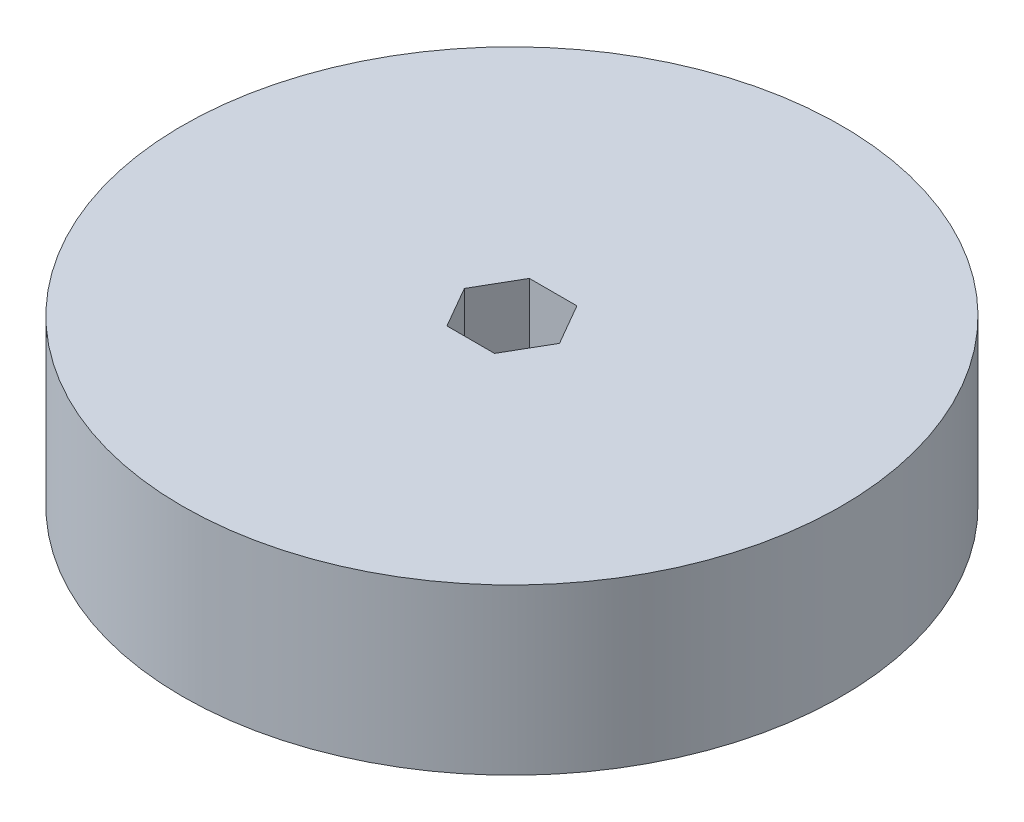
ISO-10303-21;
HEADER;
FILE_DESCRIPTION(('STEP AP214'),'2;1');
FILE_NAME('part.step','',(''),(''),'','','');
FILE_SCHEMA(('AUTOMOTIVE_DESIGN { 1 0 10303 214 1 1 1 1 }'));
ENDSEC;
DATA;
#1=APPLICATION_CONTEXT('core data for automotive mechanical design processes');
#2=APPLICATION_PROTOCOL_DEFINITION('international standard','automotive_design',2000,#1);
#3=PRODUCT_CONTEXT('',#1,'mechanical');
#4=PRODUCT('Part','Part','',(#3));
#5=PRODUCT_RELATED_PRODUCT_CATEGORY('part','',(#4));
#6=PRODUCT_DEFINITION_FORMATION('','',#4);
#7=PRODUCT_DEFINITION_CONTEXT('part definition',#1,'design');
#8=PRODUCT_DEFINITION('design','',#6,#7);
#9=PRODUCT_DEFINITION_SHAPE('','',#8);
#10=(LENGTH_UNIT() NAMED_UNIT(*) SI_UNIT(.MILLI.,.METRE.));
#11=(NAMED_UNIT(*) PLANE_ANGLE_UNIT() SI_UNIT($,.RADIAN.));
#12=(NAMED_UNIT(*) SI_UNIT($,.STERADIAN.) SOLID_ANGLE_UNIT());
#13=UNCERTAINTY_MEASURE_WITH_UNIT(LENGTH_MEASURE(1.E-05),#10,'distance_accuracy_value','');
#14=(GEOMETRIC_REPRESENTATION_CONTEXT(3) GLOBAL_UNCERTAINTY_ASSIGNED_CONTEXT((#13)) GLOBAL_UNIT_ASSIGNED_CONTEXT((#10,
#11,#12)) REPRESENTATION_CONTEXT('',''));
#15=CARTESIAN_POINT('',(0.,0.,0.));
#16=DIRECTION('',(0.,0.,1.));
#17=DIRECTION('',(1.,0.,0.));
#18=AXIS2_PLACEMENT_3D('',#15,#16,#17);
#19=CARTESIAN_POINT('',(0.,25.4,0.));
#20=DIRECTION('',(0.,-1.,0.));
#21=DIRECTION('',(0.,0.,-1.));
#22=AXIS2_PLACEMENT_3D('',#19,#20,#21);
#23=CYLINDRICAL_SURFACE('',#22,50.8);
#24=CARTESIAN_POINT('',(0.,25.4,0.));
#25=DIRECTION('',(0.,1.,0.));
#26=DIRECTION('',(0.,0.,1.));
#27=AXIS2_PLACEMENT_3D('',#24,#25,#26);
#28=CIRCLE('',#27,50.8);
#29=CARTESIAN_POINT('',(0.,25.4,50.8));
#30=VERTEX_POINT('',#29);
#31=EDGE_CURVE('E11',#30,#30,#28,.T.);
#32=ORIENTED_EDGE('',*,*,#31,.F.);
#33=EDGE_LOOP('',(#32));
#34=FACE_BOUND('',#33,.T.);
#35=CARTESIAN_POINT('',(0.,0.,0.));
#36=DIRECTION('',(0.,1.,0.));
#37=DIRECTION('',(0.,0.,1.));
#38=AXIS2_PLACEMENT_3D('',#35,#36,#37);
#39=CIRCLE('',#38,50.8);
#40=CARTESIAN_POINT('',(0.,0.,50.8));
#41=VERTEX_POINT('',#40);
#42=EDGE_CURVE('E46',#41,#41,#39,.T.);
#43=ORIENTED_EDGE('',*,*,#42,.T.);
#44=EDGE_LOOP('',(#43));
#45=FACE_BOUND('',#44,.T.);
#46=ADVANCED_FACE('F43',(#34,#45),#23,.T.);
#47=CARTESIAN_POINT('',(0.,25.4,0.));
#48=DIRECTION('',(0.,1.,0.));
#49=DIRECTION('',(0.,0.,1.));
#50=AXIS2_PLACEMENT_3D('',#47,#48,#49);
#51=PLANE('',#50);
#52=DIRECTION('',(-0.5,0.,-0.866025403784438));
#53=VECTOR('',#52,1.);
#54=CARTESIAN_POINT('',(7.33234841870825,25.4,0.));
#55=LINE('',#54,#53);
#56=CARTESIAN_POINT('',(7.33234841870825,25.4,0.));
#57=VERTEX_POINT('',#56);
#58=CARTESIAN_POINT('',(3.66617420935412,25.4,-6.35));
#59=VERTEX_POINT('',#58);
#60=EDGE_CURVE('E58',#57,#59,#55,.T.);
#61=ORIENTED_EDGE('',*,*,#60,.F.);
#62=DIRECTION('',(0.5,0.,-0.866025403784439));
#63=VECTOR('',#62,1.);
#64=CARTESIAN_POINT('',(3.66617420935413,25.4,6.35));
#65=LINE('',#64,#63);
#66=CARTESIAN_POINT('',(3.66617420935413,25.4,6.35));
#67=VERTEX_POINT('',#66);
#68=EDGE_CURVE('E118',#67,#57,#65,.T.);
#69=ORIENTED_EDGE('',*,*,#68,.F.);
#70=DIRECTION('',(1.,0.,0.));
#71=VECTOR('',#70,1.);
#72=CARTESIAN_POINT('',(-3.66617420935412,25.4,6.35));
#73=LINE('',#72,#71);
#74=CARTESIAN_POINT('',(-3.66617420935412,25.4,6.35));
#75=VERTEX_POINT('',#74);
#76=EDGE_CURVE('E122',#75,#67,#73,.T.);
#77=ORIENTED_EDGE('',*,*,#76,.F.);
#78=DIRECTION('',(0.5,0.,0.866025403784438));
#79=VECTOR('',#78,1.);
#80=CARTESIAN_POINT('',(-7.33234841870825,25.4,0.));
#81=LINE('',#80,#79);
#82=CARTESIAN_POINT('',(-7.33234841870825,25.4,0.));
#83=VERTEX_POINT('',#82);
#84=EDGE_CURVE('E145',#83,#75,#81,.T.);
#85=ORIENTED_EDGE('',*,*,#84,.F.);
#86=DIRECTION('',(-0.5,0.,0.866025403784439));
#87=VECTOR('',#86,1.);
#88=CARTESIAN_POINT('',(-3.66617420935412,25.4,-6.35));
#89=LINE('',#88,#87);
#90=CARTESIAN_POINT('',(-3.66617420935412,25.4,-6.35));
#91=VERTEX_POINT('',#90);
#92=EDGE_CURVE('E141',#91,#83,#89,.T.);
#93=ORIENTED_EDGE('',*,*,#92,.F.);
#94=DIRECTION('',(-1.,0.,0.));
#95=VECTOR('',#94,1.);
#96=CARTESIAN_POINT('',(3.66617420935412,25.4,-6.35));
#97=LINE('',#96,#95);
#98=EDGE_CURVE('E138',#59,#91,#97,.T.);
#99=ORIENTED_EDGE('',*,*,#98,.F.);
#100=EDGE_LOOP('',(#61,#69,#77,#85,#93,#99));
#101=FACE_BOUND('',#100,.T.);
#102=ORIENTED_EDGE('',*,*,#31,.T.);
#103=EDGE_LOOP('',(#102));
#104=FACE_BOUND('',#103,.T.);
#105=ADVANCED_FACE('F169',(#101,#104),#51,.T.);
#106=CARTESIAN_POINT('',(0.,0.,0.));
#107=DIRECTION('',(0.,1.,0.));
#108=DIRECTION('',(0.,0.,1.));
#109=AXIS2_PLACEMENT_3D('',#106,#107,#108);
#110=PLANE('',#109);
#111=DIRECTION('',(0.5,0.,-0.866025403784439));
#112=VECTOR('',#111,1.);
#113=CARTESIAN_POINT('',(3.66617420935413,0.,6.35));
#114=LINE('',#113,#112);
#115=CARTESIAN_POINT('',(3.66617420935413,0.,6.35));
#116=VERTEX_POINT('',#115);
#117=CARTESIAN_POINT('',(7.33234841870825,0.,0.));
#118=VERTEX_POINT('',#117);
#119=EDGE_CURVE('E105',#116,#118,#114,.T.);
#120=ORIENTED_EDGE('',*,*,#119,.T.);
#121=DIRECTION('',(-0.5,0.,-0.866025403784438));
#122=VECTOR('',#121,1.);
#123=CARTESIAN_POINT('',(7.33234841870825,0.,0.));
#124=LINE('',#123,#122);
#125=CARTESIAN_POINT('',(3.66617420935412,0.,-6.35));
#126=VERTEX_POINT('',#125);
#127=EDGE_CURVE('E98',#118,#126,#124,.T.);
#128=ORIENTED_EDGE('',*,*,#127,.T.);
#129=DIRECTION('',(-1.,0.,0.));
#130=VECTOR('',#129,1.);
#131=CARTESIAN_POINT('',(3.66617420935412,0.,-6.35));
#132=LINE('',#131,#130);
#133=CARTESIAN_POINT('',(-3.66617420935412,0.,-6.35));
#134=VERTEX_POINT('',#133);
#135=EDGE_CURVE('E108',#126,#134,#132,.T.);
#136=ORIENTED_EDGE('',*,*,#135,.T.);
#137=DIRECTION('',(-0.5,0.,0.866025403784439));
#138=VECTOR('',#137,1.);
#139=CARTESIAN_POINT('',(-3.66617420935412,0.,-6.35));
#140=LINE('',#139,#138);
#141=CARTESIAN_POINT('',(-7.33234841870825,0.,0.));
#142=VERTEX_POINT('',#141);
#143=EDGE_CURVE('E66',#134,#142,#140,.T.);
#144=ORIENTED_EDGE('',*,*,#143,.T.);
#145=DIRECTION('',(0.5,0.,0.866025403784438));
#146=VECTOR('',#145,1.);
#147=CARTESIAN_POINT('',(-7.33234841870825,0.,0.));
#148=LINE('',#147,#146);
#149=CARTESIAN_POINT('',(-3.66617420935412,0.,6.35));
#150=VERTEX_POINT('',#149);
#151=EDGE_CURVE('E127',#142,#150,#148,.T.);
#152=ORIENTED_EDGE('',*,*,#151,.T.);
#153=DIRECTION('',(1.,0.,0.));
#154=VECTOR('',#153,1.);
#155=CARTESIAN_POINT('',(-3.66617420935412,0.,6.35));
#156=LINE('',#155,#154);
#157=EDGE_CURVE('E131',#150,#116,#156,.T.);
#158=ORIENTED_EDGE('',*,*,#157,.T.);
#159=EDGE_LOOP('',(#120,#128,#136,#144,#152,#158));
#160=FACE_BOUND('',#159,.T.);
#161=ORIENTED_EDGE('',*,*,#42,.F.);
#162=EDGE_LOOP('',(#161));
#163=FACE_BOUND('',#162,.T.);
#164=ADVANCED_FACE('F113',(#160,#163),#110,.F.);
#165=CARTESIAN_POINT('',(7.33234841870825,0.,0.));
#166=DIRECTION('',(0.866025403784438,0.,-0.5));
#167=DIRECTION('',(-0.5,0.,-0.866025403784439));
#168=AXIS2_PLACEMENT_3D('',#165,#166,#167);
#169=PLANE('',#168);
#170=ORIENTED_EDGE('',*,*,#60,.T.);
#171=DIRECTION('',(0.,1.,0.));
#172=VECTOR('',#171,1.);
#173=CARTESIAN_POINT('',(3.66617420935412,0.,-6.35));
#174=LINE('',#173,#172);
#175=EDGE_CURVE('E94',#126,#59,#174,.T.);
#176=ORIENTED_EDGE('',*,*,#175,.F.);
#177=ORIENTED_EDGE('',*,*,#127,.F.);
#178=DIRECTION('',(0.,1.,0.));
#179=VECTOR('',#178,1.);
#180=CARTESIAN_POINT('',(7.33234841870825,0.,0.));
#181=LINE('',#180,#179);
#182=EDGE_CURVE('E152',#118,#57,#181,.T.);
#183=ORIENTED_EDGE('',*,*,#182,.T.);
#184=EDGE_LOOP('',(#170,#176,#177,#183));
#185=FACE_BOUND('',#184,.T.);
#186=ADVANCED_FACE('F96',(#185),#169,.F.);
#187=CARTESIAN_POINT('',(3.66617420935413,0.,6.35));
#188=DIRECTION('',(0.866025403784439,0.,0.5));
#189=DIRECTION('',(0.5,0.,-0.866025403784439));
#190=AXIS2_PLACEMENT_3D('',#187,#188,#189);
#191=PLANE('',#190);
#192=ORIENTED_EDGE('',*,*,#68,.T.);
#193=ORIENTED_EDGE('',*,*,#182,.F.);
#194=ORIENTED_EDGE('',*,*,#119,.F.);
#195=DIRECTION('',(0.,1.,0.));
#196=VECTOR('',#195,1.);
#197=CARTESIAN_POINT('',(3.66617420935413,0.,6.35));
#198=LINE('',#197,#196);
#199=EDGE_CURVE('E155',#116,#67,#198,.T.);
#200=ORIENTED_EDGE('',*,*,#199,.T.);
#201=EDGE_LOOP('',(#192,#193,#194,#200));
#202=FACE_BOUND('',#201,.T.);
#203=ADVANCED_FACE('F180',(#202),#191,.F.);
#204=CARTESIAN_POINT('',(-3.66617420935412,0.,6.35));
#205=DIRECTION('',(0.,0.,1.));
#206=DIRECTION('',(1.,0.,0.));
#207=AXIS2_PLACEMENT_3D('',#204,#205,#206);
#208=PLANE('',#207);
#209=ORIENTED_EDGE('',*,*,#76,.T.);
#210=ORIENTED_EDGE('',*,*,#199,.F.);
#211=ORIENTED_EDGE('',*,*,#157,.F.);
#212=DIRECTION('',(0.,1.,0.));
#213=VECTOR('',#212,1.);
#214=CARTESIAN_POINT('',(-3.66617420935412,0.,6.35));
#215=LINE('',#214,#213);
#216=EDGE_CURVE('E158',#150,#75,#215,.T.);
#217=ORIENTED_EDGE('',*,*,#216,.T.);
#218=EDGE_LOOP('',(#209,#210,#211,#217));
#219=FACE_BOUND('',#218,.T.);
#220=ADVANCED_FACE('F178',(#219),#208,.F.);
#221=CARTESIAN_POINT('',(-7.33234841870825,0.,0.));
#222=DIRECTION('',(-0.866025403784438,0.,0.5));
#223=DIRECTION('',(0.5,0.,0.866025403784439));
#224=AXIS2_PLACEMENT_3D('',#221,#222,#223);
#225=PLANE('',#224);
#226=ORIENTED_EDGE('',*,*,#84,.T.);
#227=ORIENTED_EDGE('',*,*,#216,.F.);
#228=ORIENTED_EDGE('',*,*,#151,.F.);
#229=DIRECTION('',(0.,1.,0.));
#230=VECTOR('',#229,1.);
#231=CARTESIAN_POINT('',(-7.33234841870825,0.,0.));
#232=LINE('',#231,#230);
#233=EDGE_CURVE('E161',#142,#83,#232,.T.);
#234=ORIENTED_EDGE('',*,*,#233,.T.);
#235=EDGE_LOOP('',(#226,#227,#228,#234));
#236=FACE_BOUND('',#235,.T.);
#237=ADVANCED_FACE('F174',(#236),#225,.F.);
#238=CARTESIAN_POINT('',(-3.66617420935412,0.,-6.35));
#239=DIRECTION('',(-0.866025403784439,0.,-0.5));
#240=DIRECTION('',(-0.5,0.,0.866025403784439));
#241=AXIS2_PLACEMENT_3D('',#238,#239,#240);
#242=PLANE('',#241);
#243=ORIENTED_EDGE('',*,*,#92,.T.);
#244=ORIENTED_EDGE('',*,*,#233,.F.);
#245=ORIENTED_EDGE('',*,*,#143,.F.);
#246=DIRECTION('',(0.,1.,0.));
#247=VECTOR('',#246,1.);
#248=CARTESIAN_POINT('',(-3.66617420935412,0.,-6.35));
#249=LINE('',#248,#247);
#250=EDGE_CURVE('E104',#134,#91,#249,.T.);
#251=ORIENTED_EDGE('',*,*,#250,.T.);
#252=EDGE_LOOP('',(#243,#244,#245,#251));
#253=FACE_BOUND('',#252,.T.);
#254=ADVANCED_FACE('F165',(#253),#242,.F.);
#255=CARTESIAN_POINT('',(3.66617420935412,0.,-6.35));
#256=DIRECTION('',(0.,0.,-1.));
#257=DIRECTION('',(-1.,0.,0.));
#258=AXIS2_PLACEMENT_3D('',#255,#256,#257);
#259=PLANE('',#258);
#260=ORIENTED_EDGE('',*,*,#98,.T.);
#261=ORIENTED_EDGE('',*,*,#250,.F.);
#262=ORIENTED_EDGE('',*,*,#135,.F.);
#263=ORIENTED_EDGE('',*,*,#175,.T.);
#264=EDGE_LOOP('',(#260,#261,#262,#263));
#265=FACE_BOUND('',#264,.T.);
#266=ADVANCED_FACE('F109',(#265),#259,.F.);
#267=CLOSED_SHELL('',(#46,#105,#164,#186,#203,#220,#237,#254,#266));
#268=MANIFOLD_SOLID_BREP('B2',#267);
#269=ADVANCED_BREP_SHAPE_REPRESENTATION('',(#18,#268),#14);
#270=SHAPE_DEFINITION_REPRESENTATION(#9,#269);
ENDSEC;
END-ISO-10303-21;
